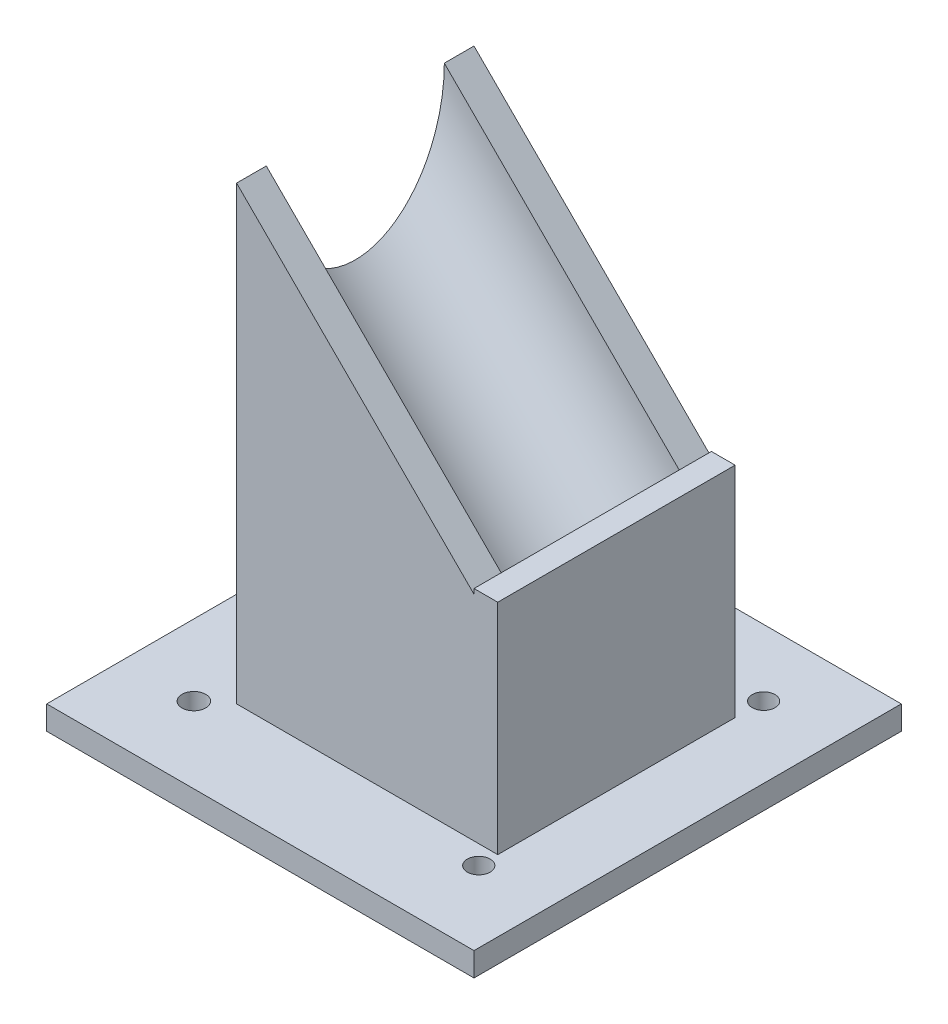
ISO-10303-21;
HEADER;
FILE_DESCRIPTION(('STEP AP214'),'2;1');
FILE_NAME('part.step','',(''),(''),'','','');
FILE_SCHEMA(('AUTOMOTIVE_DESIGN { 1 0 10303 214 1 1 1 1 }'));
ENDSEC;
DATA;
#1=APPLICATION_CONTEXT('core data for automotive mechanical design processes');
#2=APPLICATION_PROTOCOL_DEFINITION('international standard','automotive_design',2000,#1);
#3=PRODUCT_CONTEXT('',#1,'mechanical');
#4=PRODUCT('Part','Part','',(#3));
#5=PRODUCT_RELATED_PRODUCT_CATEGORY('part','',(#4));
#6=PRODUCT_DEFINITION_FORMATION('','',#4);
#7=PRODUCT_DEFINITION_CONTEXT('part definition',#1,'design');
#8=PRODUCT_DEFINITION('design','',#6,#7);
#9=PRODUCT_DEFINITION_SHAPE('','',#8);
#10=(LENGTH_UNIT() NAMED_UNIT(*) SI_UNIT(.MILLI.,.METRE.));
#11=(NAMED_UNIT(*) PLANE_ANGLE_UNIT() SI_UNIT($,.RADIAN.));
#12=(NAMED_UNIT(*) SI_UNIT($,.STERADIAN.) SOLID_ANGLE_UNIT());
#13=UNCERTAINTY_MEASURE_WITH_UNIT(LENGTH_MEASURE(1.E-05),#10,'distance_accuracy_value','');
#14=(GEOMETRIC_REPRESENTATION_CONTEXT(3) GLOBAL_UNCERTAINTY_ASSIGNED_CONTEXT((#13)) GLOBAL_UNIT_ASSIGNED_CONTEXT((#10,
#11,#12)) REPRESENTATION_CONTEXT('',''));
#15=CARTESIAN_POINT('',(0.,0.,0.));
#16=DIRECTION('',(0.,0.,1.));
#17=DIRECTION('',(1.,0.,0.));
#18=AXIS2_PLACEMENT_3D('',#15,#16,#17);
#19=CARTESIAN_POINT('',(0.,5.,0.));
#20=DIRECTION('',(0.,-1.,0.));
#21=DIRECTION('',(0.,0.,-1.));
#22=AXIS2_PLACEMENT_3D('',#19,#20,#21);
#23=PLANE('',#22);
#24=CARTESIAN_POINT('',(4.99999999999999,5.,54.));
#25=DIRECTION('',(0.,1.,0.));
#26=DIRECTION('',(0.,0.,1.));
#27=AXIS2_PLACEMENT_3D('',#24,#25,#26);
#28=CIRCLE('',#27,2.4);
#29=CARTESIAN_POINT('',(4.99999999999999,5.,56.4));
#30=VERTEX_POINT('',#29);
#31=EDGE_CURVE('E349',#30,#30,#28,.T.);
#32=ORIENTED_EDGE('',*,*,#31,.F.);
#33=EDGE_LOOP('',(#32));
#34=FACE_BOUND('',#33,.T.);
#35=CARTESIAN_POINT('',(-55.,5.,-6.00000000000001));
#36=DIRECTION('',(0.,1.,0.));
#37=DIRECTION('',(0.,0.,1.));
#38=AXIS2_PLACEMENT_3D('',#35,#36,#37);
#39=CIRCLE('',#38,2.5);
#40=CARTESIAN_POINT('',(-55.,5.,-3.5));
#41=VERTEX_POINT('',#40);
#42=EDGE_CURVE('E352',#41,#41,#39,.T.);
#43=ORIENTED_EDGE('',*,*,#42,.F.);
#44=EDGE_LOOP('',(#43));
#45=FACE_BOUND('',#44,.T.);
#46=CARTESIAN_POINT('',(-55.,5.,54.));
#47=DIRECTION('',(0.,1.,0.));
#48=DIRECTION('',(0.,0.,1.));
#49=AXIS2_PLACEMENT_3D('',#46,#47,#48);
#50=CIRCLE('',#49,2.5);
#51=CARTESIAN_POINT('',(-55.,5.,56.5));
#52=VERTEX_POINT('',#51);
#53=EDGE_CURVE('E353',#52,#52,#50,.T.);
#54=ORIENTED_EDGE('',*,*,#53,.F.);
#55=EDGE_LOOP('',(#54));
#56=FACE_BOUND('',#55,.T.);
#57=CARTESIAN_POINT('',(4.99999999999999,5.,-6.00000000000001));
#58=DIRECTION('',(0.,1.,0.));
#59=DIRECTION('',(0.,0.,1.));
#60=AXIS2_PLACEMENT_3D('',#57,#58,#59);
#61=CIRCLE('',#60,2.4);
#62=CARTESIAN_POINT('',(4.99999999999999,5.,-3.60000000000001));
#63=VERTEX_POINT('',#62);
#64=EDGE_CURVE('E346',#63,#63,#61,.T.);
#65=ORIENTED_EDGE('',*,*,#64,.F.);
#66=EDGE_LOOP('',(#65));
#67=FACE_BOUND('',#66,.T.);
#68=DIRECTION('',(0.,0.,-1.));
#69=VECTOR('',#68,1.);
#70=CARTESIAN_POINT('',(-70.,5.,0.));
#71=LINE('',#70,#69);
#72=CARTESIAN_POINT('',(-70.,5.,70.));
#73=VERTEX_POINT('',#72);
#74=CARTESIAN_POINT('',(-70.,5.,-20.));
#75=VERTEX_POINT('',#74);
#76=EDGE_CURVE('E148',#73,#75,#71,.T.);
#77=ORIENTED_EDGE('',*,*,#76,.F.);
#78=DIRECTION('',(1.,0.,0.));
#79=VECTOR('',#78,1.);
#80=CARTESIAN_POINT('',(0.,5.,70.));
#81=LINE('',#80,#79);
#82=CARTESIAN_POINT('',(20.,5.,70.));
#83=VERTEX_POINT('',#82);
#84=EDGE_CURVE('E202',#73,#83,#81,.T.);
#85=ORIENTED_EDGE('',*,*,#84,.T.);
#86=DIRECTION('',(0.,0.,-1.));
#87=VECTOR('',#86,1.);
#88=CARTESIAN_POINT('',(20.,5.,0.));
#89=LINE('',#88,#87);
#90=CARTESIAN_POINT('',(20.,5.,-20.));
#91=VERTEX_POINT('',#90);
#92=EDGE_CURVE('E200',#83,#91,#89,.T.);
#93=ORIENTED_EDGE('',*,*,#92,.T.);
#94=DIRECTION('',(1.,0.,0.));
#95=VECTOR('',#94,1.);
#96=CARTESIAN_POINT('',(0.,5.,-20.));
#97=LINE('',#96,#95);
#98=EDGE_CURVE('E197',#75,#91,#97,.T.);
#99=ORIENTED_EDGE('',*,*,#98,.F.);
#100=EDGE_LOOP('',(#77,#85,#93,#99));
#101=FACE_BOUND('',#100,.T.);
#102=DIRECTION('',(0.,0.,-1.));
#103=VECTOR('',#102,1.);
#104=CARTESIAN_POINT('',(5.,5.,50.));
#105=LINE('',#104,#103);
#106=CARTESIAN_POINT('',(5.,5.,50.));
#107=VERTEX_POINT('',#106);
#108=CARTESIAN_POINT('',(5.,5.,0.));
#109=VERTEX_POINT('',#108);
#110=EDGE_CURVE('E153',#107,#109,#105,.T.);
#111=ORIENTED_EDGE('',*,*,#110,.F.);
#112=DIRECTION('',(-1.,0.,0.));
#113=VECTOR('',#112,1.);
#114=CARTESIAN_POINT('',(0.,5.,50.));
#115=LINE('',#114,#113);
#116=CARTESIAN_POINT('',(-50.,5.,50.));
#117=VERTEX_POINT('',#116);
#118=EDGE_CURVE('E139',#107,#117,#115,.T.);
#119=ORIENTED_EDGE('',*,*,#118,.T.);
#120=DIRECTION('',(0.,0.,-1.));
#121=VECTOR('',#120,1.);
#122=CARTESIAN_POINT('',(-50.,5.,0.));
#123=LINE('',#122,#121);
#124=CARTESIAN_POINT('',(-50.,5.,0.));
#125=VERTEX_POINT('',#124);
#126=EDGE_CURVE('E59',#117,#125,#123,.T.);
#127=ORIENTED_EDGE('',*,*,#126,.T.);
#128=DIRECTION('',(1.,0.,0.));
#129=VECTOR('',#128,1.);
#130=CARTESIAN_POINT('',(0.,5.,0.));
#131=LINE('',#130,#129);
#132=EDGE_CURVE('E160',#125,#109,#131,.T.);
#133=ORIENTED_EDGE('',*,*,#132,.T.);
#134=EDGE_LOOP('',(#111,#119,#127,#133));
#135=FACE_BOUND('',#134,.T.);
#136=ADVANCED_FACE('F36',(#34,#45,#56,#67,#101,#135),#23,.F.);
#137=CARTESIAN_POINT('',(0.,50.,25.));
#138=DIRECTION('',(0.707106781186548,-0.707106781186548,0.));
#139=DIRECTION('',(0.707106781186548,0.707106781186548,0.));
#140=AXIS2_PLACEMENT_3D('',#137,#138,#139);
#141=CYLINDRICAL_SURFACE('',#140,18.75);
#142=CARTESIAN_POINT('',(-0.502525316941671,50.5025253169417,25.));
#143=DIRECTION('',(-0.707106781186548,0.707106781186547,0.));
#144=DIRECTION('',(-0.707106781186547,-0.707106781186548,0.));
#145=AXIS2_PLACEMENT_3D('',#142,#143,#144);
#146=CIRCLE('',#145,18.75);
#147=CARTESIAN_POINT('',(-0.502525316941686,50.5025253169417,43.75));
#148=VERTEX_POINT('',#147);
#149=CARTESIAN_POINT('',(0.,51.0050506338834,43.7365268022562));
#150=VERTEX_POINT('',#149);
#151=EDGE_CURVE('E180',#148,#150,#146,.T.);
#152=ORIENTED_EDGE('',*,*,#151,.F.);
#153=DIRECTION('',(-0.707106781186548,0.707106781186548,0.));
#154=VECTOR('',#153,1.);
#155=CARTESIAN_POINT('',(-50.,100.,43.75));
#156=LINE('',#155,#154);
#157=CARTESIAN_POINT('',(0.,50.,43.75));
#158=VERTEX_POINT('',#157);
#159=EDGE_CURVE('E242',#148,#158,#156,.F.);
#160=ORIENTED_EDGE('',*,*,#159,.T.);
#161=CARTESIAN_POINT('',(0.,50.,25.));
#162=DIRECTION('',(-1.,0.,0.));
#163=DIRECTION('',(0.,-1.,0.));
#164=AXIS2_PLACEMENT_3D('',#161,#162,#163);
#165=ELLIPSE('',#164,26.5165042944955,18.75);
#166=EDGE_CURVE('E188',#158,#150,#165,.T.);
#167=ORIENTED_EDGE('',*,*,#166,.T.);
#168=EDGE_LOOP('',(#152,#160,#167));
#169=FACE_BOUND('',#168,.T.);
#170=ADVANCED_FACE('F250',(#169),#141,.T.);
#171=CARTESIAN_POINT('',(0.,51.0050506338834,6.26347319774379));
#172=VERTEX_POINT('',#171);
#173=CARTESIAN_POINT('',(-0.502525316941686,50.5025253169417,6.25));
#174=VERTEX_POINT('',#173);
#175=EDGE_CURVE('E184',#172,#174,#146,.T.);
#176=ORIENTED_EDGE('',*,*,#175,.F.);
#177=CARTESIAN_POINT('',(0.,50.,6.25));
#178=VERTEX_POINT('',#177);
#179=EDGE_CURVE('E51',#172,#178,#165,.T.);
#180=ORIENTED_EDGE('',*,*,#179,.T.);
#181=DIRECTION('',(-0.707106781186548,0.707106781186548,0.));
#182=VECTOR('',#181,1.);
#183=CARTESIAN_POINT('',(-50.,100.,6.25000000000001));
#184=LINE('',#183,#182);
#185=EDGE_CURVE('E11',#178,#174,#184,.T.);
#186=ORIENTED_EDGE('',*,*,#185,.T.);
#187=EDGE_LOOP('',(#176,#180,#186));
#188=FACE_BOUND('',#187,.T.);
#189=ADVANCED_FACE('F272',(#188),#141,.T.);
#190=CARTESIAN_POINT('',(-50.,0.,50.));
#191=DIRECTION('',(1.,0.,0.));
#192=DIRECTION('',(0.,0.,-1.));
#193=AXIS2_PLACEMENT_3D('',#190,#191,#192);
#194=PLANE('',#193);
#195=ORIENTED_EDGE('',*,*,#126,.F.);
#196=DIRECTION('',(0.,-1.,0.));
#197=VECTOR('',#196,1.);
#198=CARTESIAN_POINT('',(-50.,0.,50.));
#199=LINE('',#198,#197);
#200=CARTESIAN_POINT('',(-50.,100.,50.));
#201=VERTEX_POINT('',#200);
#202=EDGE_CURVE('E145',#201,#117,#199,.T.);
#203=ORIENTED_EDGE('',*,*,#202,.F.);
#204=DIRECTION('',(0.,0.,1.));
#205=VECTOR('',#204,1.);
#206=CARTESIAN_POINT('',(-50.,100.,0.));
#207=LINE('',#206,#205);
#208=CARTESIAN_POINT('',(-50.,100.,43.75));
#209=VERTEX_POINT('',#208);
#210=EDGE_CURVE('E231',#209,#201,#207,.T.);
#211=ORIENTED_EDGE('',*,*,#210,.F.);
#212=CARTESIAN_POINT('',(-50.,100.,25.));
#213=DIRECTION('',(1.,0.,0.));
#214=DIRECTION('',(0.,1.,0.));
#215=AXIS2_PLACEMENT_3D('',#212,#213,#214);
#216=ELLIPSE('',#215,26.5165042944955,18.75);
#217=CARTESIAN_POINT('',(-50.,100.,6.25));
#218=VERTEX_POINT('',#217);
#219=EDGE_CURVE('E218',#209,#218,#216,.T.);
#220=ORIENTED_EDGE('',*,*,#219,.T.);
#221=CARTESIAN_POINT('',(-50.,100.,0.));
#222=VERTEX_POINT('',#221);
#223=EDGE_CURVE('E233',#222,#218,#207,.T.);
#224=ORIENTED_EDGE('',*,*,#223,.F.);
#225=DIRECTION('',(0.,-1.,0.));
#226=VECTOR('',#225,1.);
#227=CARTESIAN_POINT('',(-50.,0.,0.));
#228=LINE('',#227,#226);
#229=EDGE_CURVE('E236',#222,#125,#228,.T.);
#230=ORIENTED_EDGE('',*,*,#229,.T.);
#231=EDGE_LOOP('',(#195,#203,#211,#220,#224,#230));
#232=FACE_BOUND('',#231,.T.);
#233=ADVANCED_FACE('F38',(#232),#194,.F.);
#234=CARTESIAN_POINT('',(0.,0.,50.));
#235=DIRECTION('',(0.,0.,1.));
#236=DIRECTION('',(1.,0.,0.));
#237=AXIS2_PLACEMENT_3D('',#234,#235,#236);
#238=PLANE('',#237);
#239=ORIENTED_EDGE('',*,*,#202,.T.);
#240=ORIENTED_EDGE('',*,*,#118,.F.);
#241=DIRECTION('',(0.,-1.,0.));
#242=VECTOR('',#241,1.);
#243=CARTESIAN_POINT('',(5.,5.,50.));
#244=LINE('',#243,#242);
#245=CARTESIAN_POINT('',(5.,51.0470991753442,50.));
#246=VERTEX_POINT('',#245);
#247=EDGE_CURVE('E143',#246,#107,#244,.T.);
#248=ORIENTED_EDGE('',*,*,#247,.F.);
#249=DIRECTION('',(-1.,0.,0.));
#250=VECTOR('',#249,1.);
#251=CARTESIAN_POINT('',(5.,51.0470991753442,50.));
#252=LINE('',#251,#250);
#253=CARTESIAN_POINT('',(0.,51.0470991753442,50.));
#254=VERTEX_POINT('',#253);
#255=EDGE_CURVE('E167',#246,#254,#252,.T.);
#256=ORIENTED_EDGE('',*,*,#255,.T.);
#257=DIRECTION('',(0.,-1.,0.));
#258=VECTOR('',#257,1.);
#259=CARTESIAN_POINT('',(0.,5.,50.));
#260=LINE('',#259,#258);
#261=CARTESIAN_POINT('',(0.,50.,50.));
#262=VERTEX_POINT('',#261);
#263=EDGE_CURVE('E168',#254,#262,#260,.T.);
#264=ORIENTED_EDGE('',*,*,#263,.T.);
#265=DIRECTION('',(-0.707106781186547,0.707106781186547,0.));
#266=VECTOR('',#265,1.);
#267=CARTESIAN_POINT('',(-50.,100.,50.));
#268=LINE('',#267,#266);
#269=EDGE_CURVE('E227',#262,#201,#268,.T.);
#270=ORIENTED_EDGE('',*,*,#269,.T.);
#271=EDGE_LOOP('',(#239,#240,#248,#256,#264,#270));
#272=FACE_BOUND('',#271,.T.);
#273=ADVANCED_FACE('F141',(#272),#238,.T.);
#274=CARTESIAN_POINT('',(0.,0.,0.));
#275=DIRECTION('',(0.,0.,1.));
#276=DIRECTION('',(1.,0.,0.));
#277=AXIS2_PLACEMENT_3D('',#274,#275,#276);
#278=PLANE('',#277);
#279=ORIENTED_EDGE('',*,*,#132,.F.);
#280=ORIENTED_EDGE('',*,*,#229,.F.);
#281=DIRECTION('',(-0.707106781186547,0.707106781186547,0.));
#282=VECTOR('',#281,1.);
#283=CARTESIAN_POINT('',(-50.,100.,0.));
#284=LINE('',#283,#282);
#285=CARTESIAN_POINT('',(0.,50.,0.));
#286=VERTEX_POINT('',#285);
#287=EDGE_CURVE('E228',#286,#222,#284,.T.);
#288=ORIENTED_EDGE('',*,*,#287,.F.);
#289=DIRECTION('',(0.,1.,0.));
#290=VECTOR('',#289,1.);
#291=CARTESIAN_POINT('',(0.,5.,0.));
#292=LINE('',#291,#290);
#293=CARTESIAN_POINT('',(0.,51.0470991753442,0.));
#294=VERTEX_POINT('',#293);
#295=EDGE_CURVE('E171',#286,#294,#292,.T.);
#296=ORIENTED_EDGE('',*,*,#295,.T.);
#297=DIRECTION('',(-1.,0.,0.));
#298=VECTOR('',#297,1.);
#299=CARTESIAN_POINT('',(5.,51.0470991753442,0.));
#300=LINE('',#299,#298);
#301=CARTESIAN_POINT('',(5.,51.0470991753442,0.));
#302=VERTEX_POINT('',#301);
#303=EDGE_CURVE('E176',#302,#294,#300,.T.);
#304=ORIENTED_EDGE('',*,*,#303,.F.);
#305=DIRECTION('',(0.,1.,0.));
#306=VECTOR('',#305,1.);
#307=CARTESIAN_POINT('',(5.,5.,0.));
#308=LINE('',#307,#306);
#309=EDGE_CURVE('E161',#109,#302,#308,.T.);
#310=ORIENTED_EDGE('',*,*,#309,.F.);
#311=EDGE_LOOP('',(#279,#280,#288,#296,#304,#310));
#312=FACE_BOUND('',#311,.T.);
#313=ADVANCED_FACE('F267',(#312),#278,.F.);
#314=CARTESIAN_POINT('',(-50.,100.,0.));
#315=DIRECTION('',(0.707106781186547,0.707106781186547,0.));
#316=DIRECTION('',(-0.707106781186548,0.707106781186548,0.));
#317=AXIS2_PLACEMENT_3D('',#314,#315,#316);
#318=PLANE('',#317);
#319=ORIENTED_EDGE('',*,*,#185,.F.);
#320=DIRECTION('',(0.,0.,-1.));
#321=VECTOR('',#320,1.);
#322=CARTESIAN_POINT('',(0.,50.,50.));
#323=LINE('',#322,#321);
#324=EDGE_CURVE('E238',#178,#286,#323,.T.);
#325=ORIENTED_EDGE('',*,*,#324,.T.);
#326=ORIENTED_EDGE('',*,*,#287,.T.);
#327=ORIENTED_EDGE('',*,*,#223,.T.);
#328=DIRECTION('',(-0.707106781186548,0.707106781186547,0.));
#329=VECTOR('',#328,1.);
#330=CARTESIAN_POINT('',(-0.502525316941691,50.5025253169417,6.25));
#331=LINE('',#330,#329);
#332=EDGE_CURVE('E183',#174,#218,#331,.T.);
#333=ORIENTED_EDGE('',*,*,#332,.F.);
#334=EDGE_LOOP('',(#319,#325,#326,#327,#333));
#335=FACE_BOUND('',#334,.T.);
#336=ADVANCED_FACE('F265',(#335),#318,.T.);
#337=EDGE_CURVE('E44',#209,#148,#156,.F.);
#338=ORIENTED_EDGE('',*,*,#337,.F.);
#339=ORIENTED_EDGE('',*,*,#210,.T.);
#340=ORIENTED_EDGE('',*,*,#269,.F.);
#341=EDGE_CURVE('E240',#262,#158,#323,.T.);
#342=ORIENTED_EDGE('',*,*,#341,.T.);
#343=ORIENTED_EDGE('',*,*,#159,.F.);
#344=EDGE_LOOP('',(#338,#339,#340,#342,#343));
#345=FACE_BOUND('',#344,.T.);
#346=ADVANCED_FACE('F253',(#345),#318,.T.);
#347=CARTESIAN_POINT('',(-70.,5.,0.));
#348=DIRECTION('',(-1.,0.,0.));
#349=DIRECTION('',(0.,0.,1.));
#350=AXIS2_PLACEMENT_3D('',#347,#348,#349);
#351=PLANE('',#350);
#352=DIRECTION('',(0.,0.,-1.));
#353=VECTOR('',#352,1.);
#354=CARTESIAN_POINT('',(-70.,0.,0.));
#355=LINE('',#354,#353);
#356=CARTESIAN_POINT('',(-70.,0.,70.));
#357=VERTEX_POINT('',#356);
#358=CARTESIAN_POINT('',(-70.,0.,-20.));
#359=VERTEX_POINT('',#358);
#360=EDGE_CURVE('E191',#357,#359,#355,.T.);
#361=ORIENTED_EDGE('',*,*,#360,.F.);
#362=DIRECTION('',(0.,-1.,0.));
#363=VECTOR('',#362,1.);
#364=CARTESIAN_POINT('',(-70.,5.,70.));
#365=LINE('',#364,#363);
#366=EDGE_CURVE('E216',#73,#357,#365,.T.);
#367=ORIENTED_EDGE('',*,*,#366,.F.);
#368=ORIENTED_EDGE('',*,*,#76,.T.);
#369=DIRECTION('',(0.,-1.,0.));
#370=VECTOR('',#369,1.);
#371=CARTESIAN_POINT('',(-70.,5.,-20.));
#372=LINE('',#371,#370);
#373=EDGE_CURVE('E205',#75,#359,#372,.T.);
#374=ORIENTED_EDGE('',*,*,#373,.T.);
#375=EDGE_LOOP('',(#361,#367,#368,#374));
#376=FACE_BOUND('',#375,.T.);
#377=ADVANCED_FACE('F300',(#376),#351,.T.);
#378=CARTESIAN_POINT('',(0.,5.,70.));
#379=DIRECTION('',(0.,0.,-1.));
#380=DIRECTION('',(-1.,0.,0.));
#381=AXIS2_PLACEMENT_3D('',#378,#379,#380);
#382=PLANE('',#381);
#383=DIRECTION('',(1.,0.,0.));
#384=VECTOR('',#383,1.);
#385=CARTESIAN_POINT('',(0.,0.,70.));
#386=LINE('',#385,#384);
#387=CARTESIAN_POINT('',(20.,0.,70.));
#388=VERTEX_POINT('',#387);
#389=EDGE_CURVE('E193',#357,#388,#386,.T.);
#390=ORIENTED_EDGE('',*,*,#389,.T.);
#391=DIRECTION('',(0.,-1.,0.));
#392=VECTOR('',#391,1.);
#393=CARTESIAN_POINT('',(20.,5.,70.));
#394=LINE('',#393,#392);
#395=EDGE_CURVE('E219',#83,#388,#394,.T.);
#396=ORIENTED_EDGE('',*,*,#395,.F.);
#397=ORIENTED_EDGE('',*,*,#84,.F.);
#398=ORIENTED_EDGE('',*,*,#366,.T.);
#399=EDGE_LOOP('',(#390,#396,#397,#398));
#400=FACE_BOUND('',#399,.T.);
#401=ADVANCED_FACE('F296',(#400),#382,.F.);
#402=CARTESIAN_POINT('',(20.,5.,0.));
#403=DIRECTION('',(-1.,0.,0.));
#404=DIRECTION('',(0.,0.,1.));
#405=AXIS2_PLACEMENT_3D('',#402,#403,#404);
#406=PLANE('',#405);
#407=DIRECTION('',(0.,0.,-1.));
#408=VECTOR('',#407,1.);
#409=CARTESIAN_POINT('',(20.,0.,0.));
#410=LINE('',#409,#408);
#411=CARTESIAN_POINT('',(20.,0.,-20.));
#412=VERTEX_POINT('',#411);
#413=EDGE_CURVE('E211',#388,#412,#410,.T.);
#414=ORIENTED_EDGE('',*,*,#413,.T.);
#415=DIRECTION('',(0.,-1.,0.));
#416=VECTOR('',#415,1.);
#417=CARTESIAN_POINT('',(20.,5.,-20.));
#418=LINE('',#417,#416);
#419=EDGE_CURVE('E222',#91,#412,#418,.T.);
#420=ORIENTED_EDGE('',*,*,#419,.F.);
#421=ORIENTED_EDGE('',*,*,#92,.F.);
#422=ORIENTED_EDGE('',*,*,#395,.T.);
#423=EDGE_LOOP('',(#414,#420,#421,#422));
#424=FACE_BOUND('',#423,.T.);
#425=ADVANCED_FACE('F299',(#424),#406,.F.);
#426=CARTESIAN_POINT('',(0.,5.,-20.));
#427=DIRECTION('',(0.,0.,-1.));
#428=DIRECTION('',(-1.,0.,0.));
#429=AXIS2_PLACEMENT_3D('',#426,#427,#428);
#430=PLANE('',#429);
#431=DIRECTION('',(1.,0.,0.));
#432=VECTOR('',#431,1.);
#433=CARTESIAN_POINT('',(0.,0.,-20.));
#434=LINE('',#433,#432);
#435=EDGE_CURVE('E208',#359,#412,#434,.T.);
#436=ORIENTED_EDGE('',*,*,#435,.F.);
#437=ORIENTED_EDGE('',*,*,#373,.F.);
#438=ORIENTED_EDGE('',*,*,#98,.T.);
#439=ORIENTED_EDGE('',*,*,#419,.T.);
#440=EDGE_LOOP('',(#436,#437,#438,#439));
#441=FACE_BOUND('',#440,.T.);
#442=ADVANCED_FACE('F304',(#441),#430,.T.);
#443=CARTESIAN_POINT('',(0.,0.,50.));
#444=DIRECTION('',(0.,1.,0.));
#445=DIRECTION('',(0.,0.,1.));
#446=AXIS2_PLACEMENT_3D('',#443,#444,#445);
#447=PLANE('',#446);
#448=CARTESIAN_POINT('',(4.99999999999999,0.,54.));
#449=DIRECTION('',(0.,1.,0.));
#450=DIRECTION('',(0.,0.,1.));
#451=AXIS2_PLACEMENT_3D('',#448,#449,#450);
#452=CIRCLE('',#451,2.4);
#453=CARTESIAN_POINT('',(4.99999999999999,0.,56.4));
#454=VERTEX_POINT('',#453);
#455=EDGE_CURVE('E324',#454,#454,#452,.T.);
#456=ORIENTED_EDGE('',*,*,#455,.T.);
#457=EDGE_LOOP('',(#456));
#458=FACE_BOUND('',#457,.T.);
#459=CARTESIAN_POINT('',(-55.,0.,-6.00000000000001));
#460=DIRECTION('',(0.,1.,0.));
#461=DIRECTION('',(0.,0.,1.));
#462=AXIS2_PLACEMENT_3D('',#459,#460,#461);
#463=CIRCLE('',#462,2.5);
#464=CARTESIAN_POINT('',(-55.,0.,-3.5));
#465=VERTEX_POINT('',#464);
#466=EDGE_CURVE('E328',#465,#465,#463,.T.);
#467=ORIENTED_EDGE('',*,*,#466,.T.);
#468=EDGE_LOOP('',(#467));
#469=FACE_BOUND('',#468,.T.);
#470=CARTESIAN_POINT('',(-55.,0.,54.));
#471=DIRECTION('',(0.,1.,0.));
#472=DIRECTION('',(0.,0.,1.));
#473=AXIS2_PLACEMENT_3D('',#470,#471,#472);
#474=CIRCLE('',#473,2.5);
#475=CARTESIAN_POINT('',(-55.,0.,56.5));
#476=VERTEX_POINT('',#475);
#477=EDGE_CURVE('E332',#476,#476,#474,.T.);
#478=ORIENTED_EDGE('',*,*,#477,.T.);
#479=EDGE_LOOP('',(#478));
#480=FACE_BOUND('',#479,.T.);
#481=CARTESIAN_POINT('',(4.99999999999999,0.,-6.00000000000001));
#482=DIRECTION('',(0.,1.,0.));
#483=DIRECTION('',(0.,0.,1.));
#484=AXIS2_PLACEMENT_3D('',#481,#482,#483);
#485=CIRCLE('',#484,2.4);
#486=CARTESIAN_POINT('',(4.99999999999999,0.,-3.60000000000001));
#487=VERTEX_POINT('',#486);
#488=EDGE_CURVE('E172',#487,#487,#485,.T.);
#489=ORIENTED_EDGE('',*,*,#488,.T.);
#490=EDGE_LOOP('',(#489));
#491=FACE_BOUND('',#490,.T.);
#492=ORIENTED_EDGE('',*,*,#360,.T.);
#493=ORIENTED_EDGE('',*,*,#435,.T.);
#494=ORIENTED_EDGE('',*,*,#413,.F.);
#495=ORIENTED_EDGE('',*,*,#389,.F.);
#496=EDGE_LOOP('',(#492,#493,#494,#495));
#497=FACE_BOUND('',#496,.T.);
#498=ADVANCED_FACE('F284',(#458,#469,#480,#491,#497),#447,.F.);
#499=CARTESIAN_POINT('',(-0.502525316941671,50.5025253169417,25.));
#500=DIRECTION('',(-0.707106781186548,0.707106781186547,0.));
#501=DIRECTION('',(-0.707106781186547,-0.707106781186548,0.));
#502=AXIS2_PLACEMENT_3D('',#499,#500,#501);
#503=PLANE('',#502);
#504=DIRECTION('',(0.,0.,-1.));
#505=VECTOR('',#504,1.);
#506=CARTESIAN_POINT('',(0.,51.0050506338834,50.));
#507=LINE('',#506,#505);
#508=EDGE_CURVE('E186',#150,#172,#507,.T.);
#509=ORIENTED_EDGE('',*,*,#508,.T.);
#510=ORIENTED_EDGE('',*,*,#175,.T.);
#511=EDGE_CURVE('E179',#174,#148,#146,.T.);
#512=ORIENTED_EDGE('',*,*,#511,.T.);
#513=ORIENTED_EDGE('',*,*,#151,.T.);
#514=EDGE_LOOP('',(#509,#510,#512,#513));
#515=FACE_BOUND('',#514,.T.);
#516=ADVANCED_FACE('F275',(#515),#503,.T.);
#517=CARTESIAN_POINT('',(-0.502525316941671,50.5025253169417,25.));
#518=DIRECTION('',(-0.707106781186548,0.707106781186547,0.));
#519=DIRECTION('',(-0.707106781186547,-0.707106781186548,0.));
#520=AXIS2_PLACEMENT_3D('',#517,#518,#519);
#521=CYLINDRICAL_SURFACE('',#520,18.75);
#522=ORIENTED_EDGE('',*,*,#332,.T.);
#523=ORIENTED_EDGE('',*,*,#219,.F.);
#524=ORIENTED_EDGE('',*,*,#337,.T.);
#525=ORIENTED_EDGE('',*,*,#511,.F.);
#526=EDGE_LOOP('',(#522,#523,#524,#525));
#527=FACE_BOUND('',#526,.T.);
#528=ADVANCED_FACE('F276',(#527),#521,.F.);
#529=CARTESIAN_POINT('',(5.,51.0470991753442,50.));
#530=DIRECTION('',(0.,-1.,0.));
#531=DIRECTION('',(0.,0.,-1.));
#532=AXIS2_PLACEMENT_3D('',#529,#530,#531);
#533=PLANE('',#532);
#534=DIRECTION('',(0.,0.,1.));
#535=VECTOR('',#534,1.);
#536=CARTESIAN_POINT('',(0.,51.0470991753442,50.));
#537=LINE('',#536,#535);
#538=EDGE_CURVE('E158',#294,#254,#537,.T.);
#539=ORIENTED_EDGE('',*,*,#538,.T.);
#540=ORIENTED_EDGE('',*,*,#255,.F.);
#541=DIRECTION('',(0.,0.,1.));
#542=VECTOR('',#541,1.);
#543=CARTESIAN_POINT('',(5.,51.0470991753442,50.));
#544=LINE('',#543,#542);
#545=EDGE_CURVE('E156',#302,#246,#544,.T.);
#546=ORIENTED_EDGE('',*,*,#545,.F.);
#547=ORIENTED_EDGE('',*,*,#303,.T.);
#548=EDGE_LOOP('',(#539,#540,#546,#547));
#549=FACE_BOUND('',#548,.T.);
#550=ADVANCED_FACE('F258',(#549),#533,.F.);
#551=CARTESIAN_POINT('',(5.,0.,0.));
#552=DIRECTION('',(-1.,0.,0.));
#553=DIRECTION('',(0.,0.,1.));
#554=AXIS2_PLACEMENT_3D('',#551,#552,#553);
#555=PLANE('',#554);
#556=ORIENTED_EDGE('',*,*,#247,.T.);
#557=ORIENTED_EDGE('',*,*,#110,.T.);
#558=ORIENTED_EDGE('',*,*,#309,.T.);
#559=ORIENTED_EDGE('',*,*,#545,.T.);
#560=EDGE_LOOP('',(#556,#557,#558,#559));
#561=FACE_BOUND('',#560,.T.);
#562=ADVANCED_FACE('F152',(#561),#555,.F.);
#563=CARTESIAN_POINT('',(0.,0.,0.));
#564=DIRECTION('',(-1.,0.,0.));
#565=DIRECTION('',(0.,0.,1.));
#566=AXIS2_PLACEMENT_3D('',#563,#564,#565);
#567=PLANE('',#566);
#568=ORIENTED_EDGE('',*,*,#295,.F.);
#569=ORIENTED_EDGE('',*,*,#324,.F.);
#570=ORIENTED_EDGE('',*,*,#179,.F.);
#571=ORIENTED_EDGE('',*,*,#508,.F.);
#572=ORIENTED_EDGE('',*,*,#166,.F.);
#573=ORIENTED_EDGE('',*,*,#341,.F.);
#574=ORIENTED_EDGE('',*,*,#263,.F.);
#575=ORIENTED_EDGE('',*,*,#538,.F.);
#576=EDGE_LOOP('',(#568,#569,#570,#571,#572,#573,#574,#575));
#577=FACE_BOUND('',#576,.T.);
#578=ADVANCED_FACE('F255',(#577),#567,.T.);
#579=CARTESIAN_POINT('',(4.99999999999999,0.,-6.00000000000001));
#580=DIRECTION('',(0.,1.,0.));
#581=DIRECTION('',(0.,0.,1.));
#582=AXIS2_PLACEMENT_3D('',#579,#580,#581);
#583=CYLINDRICAL_SURFACE('',#582,2.4);
#584=ORIENTED_EDGE('',*,*,#488,.F.);
#585=EDGE_LOOP('',(#584));
#586=FACE_BOUND('',#585,.T.);
#587=ORIENTED_EDGE('',*,*,#64,.T.);
#588=EDGE_LOOP('',(#587));
#589=FACE_BOUND('',#588,.T.);
#590=ADVANCED_FACE('F368',(#586,#589),#583,.F.);
#591=CARTESIAN_POINT('',(-55.,0.,54.));
#592=DIRECTION('',(0.,1.,0.));
#593=DIRECTION('',(0.,0.,1.));
#594=AXIS2_PLACEMENT_3D('',#591,#592,#593);
#595=CYLINDRICAL_SURFACE('',#594,2.5);
#596=ORIENTED_EDGE('',*,*,#477,.F.);
#597=EDGE_LOOP('',(#596));
#598=FACE_BOUND('',#597,.T.);
#599=ORIENTED_EDGE('',*,*,#53,.T.);
#600=EDGE_LOOP('',(#599));
#601=FACE_BOUND('',#600,.T.);
#602=ADVANCED_FACE('F363',(#598,#601),#595,.F.);
#603=CARTESIAN_POINT('',(-55.,0.,-6.00000000000001));
#604=DIRECTION('',(0.,1.,0.));
#605=DIRECTION('',(0.,0.,1.));
#606=AXIS2_PLACEMENT_3D('',#603,#604,#605);
#607=CYLINDRICAL_SURFACE('',#606,2.5);
#608=ORIENTED_EDGE('',*,*,#466,.F.);
#609=EDGE_LOOP('',(#608));
#610=FACE_BOUND('',#609,.T.);
#611=ORIENTED_EDGE('',*,*,#42,.T.);
#612=EDGE_LOOP('',(#611));
#613=FACE_BOUND('',#612,.T.);
#614=ADVANCED_FACE('F375',(#610,#613),#607,.F.);
#615=CARTESIAN_POINT('',(4.99999999999999,0.,54.));
#616=DIRECTION('',(0.,1.,0.));
#617=DIRECTION('',(0.,0.,1.));
#618=AXIS2_PLACEMENT_3D('',#615,#616,#617);
#619=CYLINDRICAL_SURFACE('',#618,2.4);
#620=ORIENTED_EDGE('',*,*,#455,.F.);
#621=EDGE_LOOP('',(#620));
#622=FACE_BOUND('',#621,.T.);
#623=ORIENTED_EDGE('',*,*,#31,.T.);
#624=EDGE_LOOP('',(#623));
#625=FACE_BOUND('',#624,.T.);
#626=ADVANCED_FACE('F426',(#622,#625),#619,.F.);
#627=CLOSED_SHELL('',(#136,#170,#189,#233,#273,#313,#336,#346,#377,#401,#425,#442,#498,#516,
#528,#550,#562,#578,#590,#602,#614,#626));
#628=MANIFOLD_SOLID_BREP('B2',#627);
#629=ADVANCED_BREP_SHAPE_REPRESENTATION('',(#18,#628),#14);
#630=SHAPE_DEFINITION_REPRESENTATION(#9,#629);
ENDSEC;
END-ISO-10303-21;
